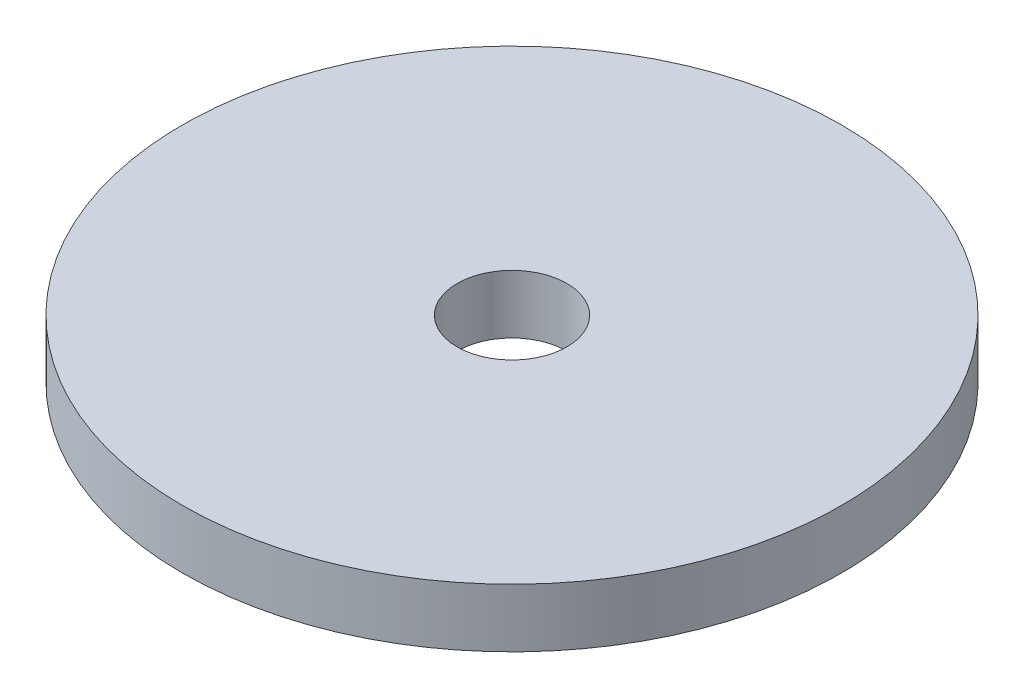
ISO-10303-21;
HEADER;
FILE_DESCRIPTION(('STEP AP214'),'2;1');
FILE_NAME('part.step','',(''),(''),'','','');
FILE_SCHEMA(('AUTOMOTIVE_DESIGN { 1 0 10303 214 1 1 1 1 }'));
ENDSEC;
DATA;
#1=APPLICATION_CONTEXT('core data for automotive mechanical design processes');
#2=APPLICATION_PROTOCOL_DEFINITION('international standard','automotive_design',2000,#1);
#3=PRODUCT_CONTEXT('',#1,'mechanical');
#4=PRODUCT('Part','Part','',(#3));
#5=PRODUCT_RELATED_PRODUCT_CATEGORY('part','',(#4));
#6=PRODUCT_DEFINITION_FORMATION('','',#4);
#7=PRODUCT_DEFINITION_CONTEXT('part definition',#1,'design');
#8=PRODUCT_DEFINITION('design','',#6,#7);
#9=PRODUCT_DEFINITION_SHAPE('','',#8);
#10=(LENGTH_UNIT() NAMED_UNIT(*) SI_UNIT(.MILLI.,.METRE.));
#11=(NAMED_UNIT(*) PLANE_ANGLE_UNIT() SI_UNIT($,.RADIAN.));
#12=(NAMED_UNIT(*) SI_UNIT($,.STERADIAN.) SOLID_ANGLE_UNIT());
#13=UNCERTAINTY_MEASURE_WITH_UNIT(LENGTH_MEASURE(1.E-05),#10,'distance_accuracy_value','');
#14=(GEOMETRIC_REPRESENTATION_CONTEXT(3) GLOBAL_UNCERTAINTY_ASSIGNED_CONTEXT((#13)) GLOBAL_UNIT_ASSIGNED_CONTEXT((#10,
#11,#12)) REPRESENTATION_CONTEXT('',''));
#15=CARTESIAN_POINT('',(0.,0.,0.));
#16=DIRECTION('',(0.,0.,1.));
#17=DIRECTION('',(1.,0.,0.));
#18=AXIS2_PLACEMENT_3D('',#15,#16,#17);
#19=CARTESIAN_POINT('',(0.,4.,0.));
#20=DIRECTION('',(0.,1.,0.));
#21=DIRECTION('',(0.,0.,1.));
#22=AXIS2_PLACEMENT_3D('',#19,#20,#21);
#23=PLANE('',#22);
#24=CARTESIAN_POINT('',(0.,4.,0.));
#25=DIRECTION('',(0.,1.,0.));
#26=DIRECTION('',(0.,0.,1.));
#27=AXIS2_PLACEMENT_3D('',#24,#25,#26);
#28=CIRCLE('',#27,22.5);
#29=CARTESIAN_POINT('',(0.,4.,22.5));
#30=VERTEX_POINT('',#29);
#31=EDGE_CURVE('E10',#30,#30,#28,.T.);
#32=ORIENTED_EDGE('',*,*,#31,.T.);
#33=EDGE_LOOP('',(#32));
#34=FACE_BOUND('',#33,.T.);
#35=CARTESIAN_POINT('',(0.,4.,0.));
#36=DIRECTION('',(0.,1.,0.));
#37=DIRECTION('',(0.,0.,1.));
#38=AXIS2_PLACEMENT_3D('',#35,#36,#37);
#39=CIRCLE('',#38,3.75);
#40=CARTESIAN_POINT('',(0.,4.,3.75));
#41=VERTEX_POINT('',#40);
#42=EDGE_CURVE('E42',#41,#41,#39,.T.);
#43=ORIENTED_EDGE('',*,*,#42,.F.);
#44=EDGE_LOOP('',(#43));
#45=FACE_BOUND('',#44,.T.);
#46=ADVANCED_FACE('F31',(#34,#45),#23,.T.);
#47=CARTESIAN_POINT('',(0.,0.,0.));
#48=DIRECTION('',(0.,1.,0.));
#49=DIRECTION('',(0.,0.,1.));
#50=AXIS2_PLACEMENT_3D('',#47,#48,#49);
#51=PLANE('',#50);
#52=CARTESIAN_POINT('',(0.,0.,0.));
#53=DIRECTION('',(0.,1.,0.));
#54=DIRECTION('',(0.,0.,1.));
#55=AXIS2_PLACEMENT_3D('',#52,#53,#54);
#56=CIRCLE('',#55,22.5);
#57=CARTESIAN_POINT('',(0.,0.,22.5));
#58=VERTEX_POINT('',#57);
#59=EDGE_CURVE('E35',#58,#58,#56,.T.);
#60=ORIENTED_EDGE('',*,*,#59,.F.);
#61=EDGE_LOOP('',(#60));
#62=FACE_BOUND('',#61,.T.);
#63=CARTESIAN_POINT('',(0.,0.,0.));
#64=DIRECTION('',(0.,1.,0.));
#65=DIRECTION('',(0.,0.,1.));
#66=AXIS2_PLACEMENT_3D('',#63,#64,#65);
#67=CIRCLE('',#66,3.75);
#68=CARTESIAN_POINT('',(0.,0.,3.75));
#69=VERTEX_POINT('',#68);
#70=EDGE_CURVE('E44',#69,#69,#67,.T.);
#71=ORIENTED_EDGE('',*,*,#70,.T.);
#72=EDGE_LOOP('',(#71));
#73=FACE_BOUND('',#72,.T.);
#74=ADVANCED_FACE('F54',(#62,#73),#51,.F.);
#75=CARTESIAN_POINT('',(0.,4.,0.));
#76=DIRECTION('',(0.,-1.,0.));
#77=DIRECTION('',(0.,0.,-1.));
#78=AXIS2_PLACEMENT_3D('',#75,#76,#77);
#79=CYLINDRICAL_SURFACE('',#78,22.5);
#80=ORIENTED_EDGE('',*,*,#31,.F.);
#81=EDGE_LOOP('',(#80));
#82=FACE_BOUND('',#81,.T.);
#83=ORIENTED_EDGE('',*,*,#59,.T.);
#84=EDGE_LOOP('',(#83));
#85=FACE_BOUND('',#84,.T.);
#86=ADVANCED_FACE('F33',(#82,#85),#79,.T.);
#87=CARTESIAN_POINT('',(0.,4.,0.));
#88=DIRECTION('',(0.,-1.,0.));
#89=DIRECTION('',(0.,0.,-1.));
#90=AXIS2_PLACEMENT_3D('',#87,#88,#89);
#91=CYLINDRICAL_SURFACE('',#90,3.75);
#92=ORIENTED_EDGE('',*,*,#42,.T.);
#93=EDGE_LOOP('',(#92));
#94=FACE_BOUND('',#93,.T.);
#95=ORIENTED_EDGE('',*,*,#70,.F.);
#96=EDGE_LOOP('',(#95));
#97=FACE_BOUND('',#96,.T.);
#98=ADVANCED_FACE('F50',(#94,#97),#91,.F.);
#99=CLOSED_SHELL('',(#46,#74,#86,#98));
#100=MANIFOLD_SOLID_BREP('B2',#99);
#101=ADVANCED_BREP_SHAPE_REPRESENTATION('',(#18,#100),#14);
#102=SHAPE_DEFINITION_REPRESENTATION(#9,#101);
ENDSEC;
END-ISO-10303-21;
